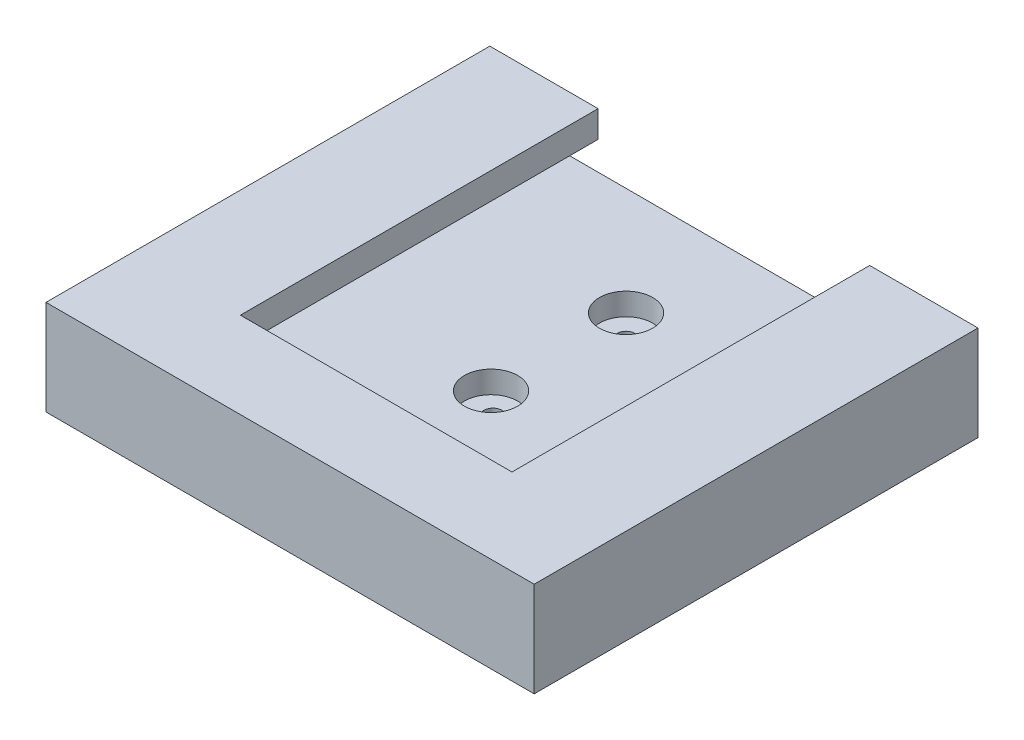
ISO-10303-21;
HEADER;
FILE_DESCRIPTION(('STEP AP214'),'2;1');
FILE_NAME('part.step','',(''),(''),'','','');
FILE_SCHEMA(('AUTOMOTIVE_DESIGN { 1 0 10303 214 1 1 1 1 }'));
ENDSEC;
DATA;
#1=APPLICATION_CONTEXT('core data for automotive mechanical design processes');
#2=APPLICATION_PROTOCOL_DEFINITION('international standard','automotive_design',2000,#1);
#3=PRODUCT_CONTEXT('',#1,'mechanical');
#4=PRODUCT('Part','Part','',(#3));
#5=PRODUCT_RELATED_PRODUCT_CATEGORY('part','',(#4));
#6=PRODUCT_DEFINITION_FORMATION('','',#4);
#7=PRODUCT_DEFINITION_CONTEXT('part definition',#1,'design');
#8=PRODUCT_DEFINITION('design','',#6,#7);
#9=PRODUCT_DEFINITION_SHAPE('','',#8);
#10=(LENGTH_UNIT() NAMED_UNIT(*) SI_UNIT(.MILLI.,.METRE.));
#11=(NAMED_UNIT(*) PLANE_ANGLE_UNIT() SI_UNIT($,.RADIAN.));
#12=(NAMED_UNIT(*) SI_UNIT($,.STERADIAN.) SOLID_ANGLE_UNIT());
#13=UNCERTAINTY_MEASURE_WITH_UNIT(LENGTH_MEASURE(1.E-05),#10,'distance_accuracy_value','');
#14=(GEOMETRIC_REPRESENTATION_CONTEXT(3) GLOBAL_UNCERTAINTY_ASSIGNED_CONTEXT((#13)) GLOBAL_UNIT_ASSIGNED_CONTEXT((#10,
#11,#12)) REPRESENTATION_CONTEXT('',''));
#15=CARTESIAN_POINT('',(0.,0.,0.));
#16=DIRECTION('',(0.,0.,1.));
#17=DIRECTION('',(1.,0.,0.));
#18=AXIS2_PLACEMENT_3D('',#15,#16,#17);
#19=CARTESIAN_POINT('',(27.4999999999998,10.7,-24.9999999999998));
#20=DIRECTION('',(-1.,0.,0.));
#21=DIRECTION('',(0.,0.,1.));
#22=AXIS2_PLACEMENT_3D('',#19,#20,#21);
#23=PLANE('',#22);
#24=DIRECTION('',(0.,0.,-1.));
#25=VECTOR('',#24,1.);
#26=CARTESIAN_POINT('',(27.4999999999998,0.,-24.9999999999998));
#27=LINE('',#26,#25);
#28=CARTESIAN_POINT('',(27.4999999999998,0.,25.0000000000002));
#29=VERTEX_POINT('',#28);
#30=CARTESIAN_POINT('',(27.4999999999998,0.,-24.9999999999998));
#31=VERTEX_POINT('',#30);
#32=EDGE_CURVE('E225',#29,#31,#27,.T.);
#33=ORIENTED_EDGE('',*,*,#32,.T.);
#34=DIRECTION('',(0.,-1.,0.));
#35=VECTOR('',#34,1.);
#36=CARTESIAN_POINT('',(27.4999999999998,10.7,-24.9999999999998));
#37=LINE('',#36,#35);
#38=CARTESIAN_POINT('',(27.4999999999998,10.7,-24.9999999999998));
#39=VERTEX_POINT('',#38);
#40=EDGE_CURVE('E11',#39,#31,#37,.T.);
#41=ORIENTED_EDGE('',*,*,#40,.F.);
#42=DIRECTION('',(0.,0.,-1.));
#43=VECTOR('',#42,1.);
#44=CARTESIAN_POINT('',(27.4999999999998,10.7,-24.9999999999998));
#45=LINE('',#44,#43);
#46=CARTESIAN_POINT('',(27.4999999999998,10.7,25.0000000000002));
#47=VERTEX_POINT('',#46);
#48=EDGE_CURVE('E234',#47,#39,#45,.T.);
#49=ORIENTED_EDGE('',*,*,#48,.F.);
#50=DIRECTION('',(0.,-1.,0.));
#51=VECTOR('',#50,1.);
#52=CARTESIAN_POINT('',(27.4999999999998,10.7,25.0000000000002));
#53=LINE('',#52,#51);
#54=EDGE_CURVE('E245',#47,#29,#53,.T.);
#55=ORIENTED_EDGE('',*,*,#54,.T.);
#56=EDGE_LOOP('',(#33,#41,#49,#55));
#57=FACE_BOUND('',#56,.T.);
#58=ADVANCED_FACE('F45',(#57),#23,.F.);
#59=CARTESIAN_POINT('',(-27.5000000000002,10.7,-24.9999999999998));
#60=DIRECTION('',(0.,0.,1.));
#61=DIRECTION('',(1.,0.,0.));
#62=AXIS2_PLACEMENT_3D('',#59,#60,#61);
#63=PLANE('',#62);
#64=DIRECTION('',(0.,1.,0.));
#65=VECTOR('',#64,1.);
#66=CARTESIAN_POINT('',(20.2999999999998,4.5,-24.9999999999998));
#67=LINE('',#66,#65);
#68=CARTESIAN_POINT('',(20.2999999999998,4.5,-24.9999999999998));
#69=VERTEX_POINT('',#68);
#70=CARTESIAN_POINT('',(20.2999999999998,7.7,-24.9999999999998));
#71=VERTEX_POINT('',#70);
#72=EDGE_CURVE('E200',#69,#71,#67,.T.);
#73=ORIENTED_EDGE('',*,*,#72,.T.);
#74=DIRECTION('',(-1.,0.,0.));
#75=VECTOR('',#74,1.);
#76=CARTESIAN_POINT('',(-20.3000000000002,7.7,-24.9999999999998));
#77=LINE('',#76,#75);
#78=CARTESIAN_POINT('',(15.2999999999998,7.7,-24.9999999999998));
#79=VERTEX_POINT('',#78);
#80=EDGE_CURVE('E173',#71,#79,#77,.T.);
#81=ORIENTED_EDGE('',*,*,#80,.T.);
#82=DIRECTION('',(0.,1.,0.));
#83=VECTOR('',#82,1.);
#84=CARTESIAN_POINT('',(15.2999999999998,7.7,-24.9999999999998));
#85=LINE('',#84,#83);
#86=CARTESIAN_POINT('',(15.2999999999998,10.7,-24.9999999999998));
#87=VERTEX_POINT('',#86);
#88=EDGE_CURVE('E226',#79,#87,#85,.T.);
#89=ORIENTED_EDGE('',*,*,#88,.T.);
#90=DIRECTION('',(-1.,0.,0.));
#91=VECTOR('',#90,1.);
#92=CARTESIAN_POINT('',(-27.5000000000002,10.7,-24.9999999999998));
#93=LINE('',#92,#91);
#94=EDGE_CURVE('E97',#39,#87,#93,.T.);
#95=ORIENTED_EDGE('',*,*,#94,.F.);
#96=ORIENTED_EDGE('',*,*,#40,.T.);
#97=DIRECTION('',(-1.,0.,0.));
#98=VECTOR('',#97,1.);
#99=CARTESIAN_POINT('',(-27.5000000000002,0.,-24.9999999999998));
#100=LINE('',#99,#98);
#101=CARTESIAN_POINT('',(-27.5000000000002,0.,-24.9999999999998));
#102=VERTEX_POINT('',#101);
#103=EDGE_CURVE('E249',#31,#102,#100,.T.);
#104=ORIENTED_EDGE('',*,*,#103,.T.);
#105=DIRECTION('',(0.,-1.,0.));
#106=VECTOR('',#105,1.);
#107=CARTESIAN_POINT('',(-27.5000000000002,10.7,-24.9999999999998));
#108=LINE('',#107,#106);
#109=CARTESIAN_POINT('',(-27.5000000000002,10.7,-24.9999999999998));
#110=VERTEX_POINT('',#109);
#111=EDGE_CURVE('E53',#110,#102,#108,.T.);
#112=ORIENTED_EDGE('',*,*,#111,.F.);
#113=CARTESIAN_POINT('',(-15.3000000000002,10.7,-24.9999999999998));
#114=VERTEX_POINT('',#113);
#115=EDGE_CURVE('E237',#114,#110,#93,.T.);
#116=ORIENTED_EDGE('',*,*,#115,.F.);
#117=DIRECTION('',(0.,1.,0.));
#118=VECTOR('',#117,1.);
#119=CARTESIAN_POINT('',(-15.3000000000002,7.7,-24.9999999999998));
#120=LINE('',#119,#118);
#121=CARTESIAN_POINT('',(-15.3000000000002,7.7,-24.9999999999998));
#122=VERTEX_POINT('',#121);
#123=EDGE_CURVE('E222',#122,#114,#120,.T.);
#124=ORIENTED_EDGE('',*,*,#123,.F.);
#125=CARTESIAN_POINT('',(-20.3000000000002,7.7,-24.9999999999998));
#126=VERTEX_POINT('',#125);
#127=EDGE_CURVE('E177',#122,#126,#77,.T.);
#128=ORIENTED_EDGE('',*,*,#127,.T.);
#129=DIRECTION('',(0.,1.,0.));
#130=VECTOR('',#129,1.);
#131=CARTESIAN_POINT('',(-20.3000000000002,4.5,-24.9999999999998));
#132=LINE('',#131,#130);
#133=CARTESIAN_POINT('',(-20.3000000000002,4.5,-24.9999999999998));
#134=VERTEX_POINT('',#133);
#135=EDGE_CURVE('E197',#134,#126,#132,.T.);
#136=ORIENTED_EDGE('',*,*,#135,.F.);
#137=DIRECTION('',(-1.,0.,0.));
#138=VECTOR('',#137,1.);
#139=CARTESIAN_POINT('',(-20.3000000000002,4.5,-24.9999999999998));
#140=LINE('',#139,#138);
#141=EDGE_CURVE('E156',#69,#134,#140,.T.);
#142=ORIENTED_EDGE('',*,*,#141,.F.);
#143=EDGE_LOOP('',(#73,#81,#89,#95,#96,#104,#112,#116,#124,#128,#136,#142));
#144=FACE_BOUND('',#143,.T.);
#145=ADVANCED_FACE('F285',(#144),#63,.F.);
#146=CARTESIAN_POINT('',(-27.5000000000002,10.7,-24.9999999999998));
#147=DIRECTION('',(1.,0.,0.));
#148=DIRECTION('',(0.,0.,-1.));
#149=AXIS2_PLACEMENT_3D('',#146,#147,#148);
#150=PLANE('',#149);
#151=DIRECTION('',(0.,0.,1.));
#152=VECTOR('',#151,1.);
#153=CARTESIAN_POINT('',(-27.5000000000002,0.,-24.9999999999998));
#154=LINE('',#153,#152);
#155=CARTESIAN_POINT('',(-27.5000000000002,0.,25.0000000000002));
#156=VERTEX_POINT('',#155);
#157=EDGE_CURVE('E252',#102,#156,#154,.T.);
#158=ORIENTED_EDGE('',*,*,#157,.T.);
#159=DIRECTION('',(0.,-1.,0.));
#160=VECTOR('',#159,1.);
#161=CARTESIAN_POINT('',(-27.5000000000002,10.7,25.0000000000002));
#162=LINE('',#161,#160);
#163=CARTESIAN_POINT('',(-27.5000000000002,10.7,25.0000000000002));
#164=VERTEX_POINT('',#163);
#165=EDGE_CURVE('E259',#164,#156,#162,.T.);
#166=ORIENTED_EDGE('',*,*,#165,.F.);
#167=DIRECTION('',(0.,0.,1.));
#168=VECTOR('',#167,1.);
#169=CARTESIAN_POINT('',(-27.5000000000002,10.7,-24.9999999999998));
#170=LINE('',#169,#168);
#171=EDGE_CURVE('E240',#110,#164,#170,.T.);
#172=ORIENTED_EDGE('',*,*,#171,.F.);
#173=ORIENTED_EDGE('',*,*,#111,.T.);
#174=EDGE_LOOP('',(#158,#166,#172,#173));
#175=FACE_BOUND('',#174,.T.);
#176=ADVANCED_FACE('F267',(#175),#150,.F.);
#177=CARTESIAN_POINT('',(-27.5000000000002,10.7,25.0000000000002));
#178=DIRECTION('',(0.,0.,-1.));
#179=DIRECTION('',(-1.,0.,0.));
#180=AXIS2_PLACEMENT_3D('',#177,#178,#179);
#181=PLANE('',#180);
#182=DIRECTION('',(1.,0.,0.));
#183=VECTOR('',#182,1.);
#184=CARTESIAN_POINT('',(-27.5000000000002,0.,25.0000000000002));
#185=LINE('',#184,#183);
#186=EDGE_CURVE('E90',#156,#29,#185,.T.);
#187=ORIENTED_EDGE('',*,*,#186,.T.);
#188=ORIENTED_EDGE('',*,*,#54,.F.);
#189=DIRECTION('',(1.,0.,0.));
#190=VECTOR('',#189,1.);
#191=CARTESIAN_POINT('',(-27.5000000000002,10.7,25.0000000000002));
#192=LINE('',#191,#190);
#193=EDGE_CURVE('E69',#164,#47,#192,.T.);
#194=ORIENTED_EDGE('',*,*,#193,.F.);
#195=ORIENTED_EDGE('',*,*,#165,.T.);
#196=EDGE_LOOP('',(#187,#188,#194,#195));
#197=FACE_BOUND('',#196,.T.);
#198=ADVANCED_FACE('F276',(#197),#181,.F.);
#199=CARTESIAN_POINT('',(0.,10.7,0.));
#200=DIRECTION('',(0.,1.,0.));
#201=DIRECTION('',(0.,0.,1.));
#202=AXIS2_PLACEMENT_3D('',#199,#200,#201);
#203=PLANE('',#202);
#204=DIRECTION('',(0.,0.,1.));
#205=VECTOR('',#204,1.);
#206=CARTESIAN_POINT('',(-15.3000000000002,10.7,-24.9999999999998));
#207=LINE('',#206,#205);
#208=CARTESIAN_POINT('',(-15.3000000000002,10.7,15.3000000000002));
#209=VERTEX_POINT('',#208);
#210=EDGE_CURVE('E60',#114,#209,#207,.T.);
#211=ORIENTED_EDGE('',*,*,#210,.F.);
#212=ORIENTED_EDGE('',*,*,#115,.T.);
#213=ORIENTED_EDGE('',*,*,#171,.T.);
#214=ORIENTED_EDGE('',*,*,#193,.T.);
#215=ORIENTED_EDGE('',*,*,#48,.T.);
#216=ORIENTED_EDGE('',*,*,#94,.T.);
#217=DIRECTION('',(0.,0.,-1.));
#218=VECTOR('',#217,1.);
#219=CARTESIAN_POINT('',(15.2999999999998,10.7,-24.9999999999998));
#220=LINE('',#219,#218);
#221=CARTESIAN_POINT('',(15.2999999999998,10.7,15.3000000000002));
#222=VERTEX_POINT('',#221);
#223=EDGE_CURVE('E211',#222,#87,#220,.T.);
#224=ORIENTED_EDGE('',*,*,#223,.F.);
#225=DIRECTION('',(1.,0.,0.));
#226=VECTOR('',#225,1.);
#227=CARTESIAN_POINT('',(-15.3000000000002,10.7,15.3000000000002));
#228=LINE('',#227,#226);
#229=EDGE_CURVE('E217',#209,#222,#228,.T.);
#230=ORIENTED_EDGE('',*,*,#229,.F.);
#231=EDGE_LOOP('',(#211,#212,#213,#214,#215,#216,#224,#230));
#232=FACE_BOUND('',#231,.T.);
#233=ADVANCED_FACE('F278',(#232),#203,.T.);
#234=CARTESIAN_POINT('',(0.,0.,0.));
#235=DIRECTION('',(0.,1.,0.));
#236=DIRECTION('',(0.,0.,1.));
#237=AXIS2_PLACEMENT_3D('',#234,#235,#236);
#238=PLANE('',#237);
#239=CARTESIAN_POINT('',(0.,0.,-12.8503180046306));
#240=DIRECTION('',(0.,1.,0.));
#241=DIRECTION('',(0.,0.,1.));
#242=AXIS2_PLACEMENT_3D('',#239,#240,#241);
#243=CIRCLE('',#242,1.);
#244=CARTESIAN_POINT('',(0.,0.,-11.8503180046306));
#245=VERTEX_POINT('',#244);
#246=EDGE_CURVE('E329',#245,#245,#243,.F.);
#247=ORIENTED_EDGE('',*,*,#246,.F.);
#248=EDGE_LOOP('',(#247));
#249=FACE_BOUND('',#248,.T.);
#250=CARTESIAN_POINT('',(0.,0.,2.14968199536938));
#251=DIRECTION('',(0.,1.,0.));
#252=DIRECTION('',(0.,0.,1.));
#253=AXIS2_PLACEMENT_3D('',#250,#251,#252);
#254=CIRCLE('',#253,1.);
#255=CARTESIAN_POINT('',(0.,0.,3.14968199536938));
#256=VERTEX_POINT('',#255);
#257=EDGE_CURVE('E340',#256,#256,#254,.F.);
#258=ORIENTED_EDGE('',*,*,#257,.F.);
#259=EDGE_LOOP('',(#258));
#260=FACE_BOUND('',#259,.T.);
#261=ORIENTED_EDGE('',*,*,#32,.F.);
#262=ORIENTED_EDGE('',*,*,#186,.F.);
#263=ORIENTED_EDGE('',*,*,#157,.F.);
#264=ORIENTED_EDGE('',*,*,#103,.F.);
#265=EDGE_LOOP('',(#261,#262,#263,#264));
#266=FACE_BOUND('',#265,.T.);
#267=ADVANCED_FACE('F272',(#249,#260,#266),#238,.F.);
#268=CARTESIAN_POINT('',(-15.3000000000002,7.7,-24.9999999999998));
#269=DIRECTION('',(-1.,0.,0.));
#270=DIRECTION('',(0.,0.,1.));
#271=AXIS2_PLACEMENT_3D('',#268,#269,#270);
#272=PLANE('',#271);
#273=ORIENTED_EDGE('',*,*,#210,.T.);
#274=DIRECTION('',(0.,1.,0.));
#275=VECTOR('',#274,1.);
#276=CARTESIAN_POINT('',(-15.3000000000002,7.7,15.3000000000002));
#277=LINE('',#276,#275);
#278=CARTESIAN_POINT('',(-15.3000000000002,7.7,15.3000000000002));
#279=VERTEX_POINT('',#278);
#280=EDGE_CURVE('E214',#279,#209,#277,.T.);
#281=ORIENTED_EDGE('',*,*,#280,.F.);
#282=DIRECTION('',(0.,0.,1.));
#283=VECTOR('',#282,1.);
#284=CARTESIAN_POINT('',(-15.3000000000002,7.7,-24.9999999999998));
#285=LINE('',#284,#283);
#286=EDGE_CURVE('E206',#122,#279,#285,.T.);
#287=ORIENTED_EDGE('',*,*,#286,.F.);
#288=ORIENTED_EDGE('',*,*,#123,.T.);
#289=EDGE_LOOP('',(#273,#281,#287,#288));
#290=FACE_BOUND('',#289,.T.);
#291=ADVANCED_FACE('F309',(#290),#272,.F.);
#292=CARTESIAN_POINT('',(15.2999999999998,7.7,-24.9999999999998));
#293=DIRECTION('',(1.,0.,0.));
#294=DIRECTION('',(0.,0.,-1.));
#295=AXIS2_PLACEMENT_3D('',#292,#293,#294);
#296=PLANE('',#295);
#297=ORIENTED_EDGE('',*,*,#223,.T.);
#298=ORIENTED_EDGE('',*,*,#88,.F.);
#299=DIRECTION('',(0.,0.,-1.));
#300=VECTOR('',#299,1.);
#301=CARTESIAN_POINT('',(15.2999999999998,7.7,-24.9999999999998));
#302=LINE('',#301,#300);
#303=CARTESIAN_POINT('',(15.2999999999998,7.7,15.3000000000002));
#304=VERTEX_POINT('',#303);
#305=EDGE_CURVE('E210',#304,#79,#302,.T.);
#306=ORIENTED_EDGE('',*,*,#305,.F.);
#307=DIRECTION('',(0.,1.,0.));
#308=VECTOR('',#307,1.);
#309=CARTESIAN_POINT('',(15.2999999999998,7.7,15.3000000000002));
#310=LINE('',#309,#308);
#311=EDGE_CURVE('E229',#304,#222,#310,.T.);
#312=ORIENTED_EDGE('',*,*,#311,.T.);
#313=EDGE_LOOP('',(#297,#298,#306,#312));
#314=FACE_BOUND('',#313,.T.);
#315=ADVANCED_FACE('F305',(#314),#296,.F.);
#316=CARTESIAN_POINT('',(-15.3000000000002,7.7,15.3000000000002));
#317=DIRECTION('',(0.,0.,1.));
#318=DIRECTION('',(1.,0.,0.));
#319=AXIS2_PLACEMENT_3D('',#316,#317,#318);
#320=PLANE('',#319);
#321=ORIENTED_EDGE('',*,*,#229,.T.);
#322=ORIENTED_EDGE('',*,*,#311,.F.);
#323=DIRECTION('',(1.,0.,0.));
#324=VECTOR('',#323,1.);
#325=CARTESIAN_POINT('',(-20.3000000000002,7.7,15.3000000000002));
#326=LINE('',#325,#324);
#327=CARTESIAN_POINT('',(20.2999999999998,7.7,15.3000000000002));
#328=VERTEX_POINT('',#327);
#329=EDGE_CURVE('E189',#304,#328,#326,.T.);
#330=ORIENTED_EDGE('',*,*,#329,.T.);
#331=DIRECTION('',(0.,1.,0.));
#332=VECTOR('',#331,1.);
#333=CARTESIAN_POINT('',(20.2999999999998,4.5,15.3000000000002));
#334=LINE('',#333,#332);
#335=CARTESIAN_POINT('',(20.2999999999998,4.5,15.3000000000002));
#336=VERTEX_POINT('',#335);
#337=EDGE_CURVE('E155',#336,#328,#334,.T.);
#338=ORIENTED_EDGE('',*,*,#337,.F.);
#339=DIRECTION('',(1.,0.,0.));
#340=VECTOR('',#339,1.);
#341=CARTESIAN_POINT('',(-20.3000000000002,4.5,15.3000000000002));
#342=LINE('',#341,#340);
#343=CARTESIAN_POINT('',(-20.3000000000002,4.5,15.3000000000002));
#344=VERTEX_POINT('',#343);
#345=EDGE_CURVE('E159',#344,#336,#342,.T.);
#346=ORIENTED_EDGE('',*,*,#345,.F.);
#347=DIRECTION('',(0.,1.,0.));
#348=VECTOR('',#347,1.);
#349=CARTESIAN_POINT('',(-20.3000000000002,4.5,15.3000000000002));
#350=LINE('',#349,#348);
#351=CARTESIAN_POINT('',(-20.3000000000002,7.7,15.3000000000002));
#352=VERTEX_POINT('',#351);
#353=EDGE_CURVE('E144',#344,#352,#350,.T.);
#354=ORIENTED_EDGE('',*,*,#353,.T.);
#355=EDGE_CURVE('E191',#352,#279,#326,.T.);
#356=ORIENTED_EDGE('',*,*,#355,.T.);
#357=ORIENTED_EDGE('',*,*,#280,.T.);
#358=EDGE_LOOP('',(#321,#322,#330,#338,#346,#354,#356,#357));
#359=FACE_BOUND('',#358,.T.);
#360=ADVANCED_FACE('F161',(#359),#320,.F.);
#361=CARTESIAN_POINT('',(0.,7.7,0.));
#362=DIRECTION('',(0.,1.,0.));
#363=DIRECTION('',(0.,0.,1.));
#364=AXIS2_PLACEMENT_3D('',#361,#362,#363);
#365=PLANE('',#364);
#366=ORIENTED_EDGE('',*,*,#355,.F.);
#367=DIRECTION('',(0.,0.,1.));
#368=VECTOR('',#367,1.);
#369=CARTESIAN_POINT('',(-20.3000000000002,7.7,-24.9999999999998));
#370=LINE('',#369,#368);
#371=EDGE_CURVE('E151',#126,#352,#370,.T.);
#372=ORIENTED_EDGE('',*,*,#371,.F.);
#373=ORIENTED_EDGE('',*,*,#127,.F.);
#374=ORIENTED_EDGE('',*,*,#286,.T.);
#375=EDGE_LOOP('',(#366,#372,#373,#374));
#376=FACE_BOUND('',#375,.T.);
#377=ADVANCED_FACE('F360',(#376),#365,.F.);
#378=ORIENTED_EDGE('',*,*,#80,.F.);
#379=DIRECTION('',(0.,0.,-1.));
#380=VECTOR('',#379,1.);
#381=CARTESIAN_POINT('',(20.2999999999998,7.7,-24.9999999999998));
#382=LINE('',#381,#380);
#383=EDGE_CURVE('E194',#328,#71,#382,.T.);
#384=ORIENTED_EDGE('',*,*,#383,.F.);
#385=ORIENTED_EDGE('',*,*,#329,.F.);
#386=ORIENTED_EDGE('',*,*,#305,.T.);
#387=EDGE_LOOP('',(#378,#384,#385,#386));
#388=FACE_BOUND('',#387,.T.);
#389=ADVANCED_FACE('F301',(#388),#365,.F.);
#390=CARTESIAN_POINT('',(-20.3000000000002,4.5,-24.9999999999998));
#391=DIRECTION('',(-1.,0.,0.));
#392=DIRECTION('',(0.,0.,1.));
#393=AXIS2_PLACEMENT_3D('',#390,#391,#392);
#394=PLANE('',#393);
#395=ORIENTED_EDGE('',*,*,#371,.T.);
#396=ORIENTED_EDGE('',*,*,#353,.F.);
#397=DIRECTION('',(0.,0.,1.));
#398=VECTOR('',#397,1.);
#399=CARTESIAN_POINT('',(-20.3000000000002,4.5,-24.9999999999998));
#400=LINE('',#399,#398);
#401=EDGE_CURVE('E148',#134,#344,#400,.T.);
#402=ORIENTED_EDGE('',*,*,#401,.F.);
#403=ORIENTED_EDGE('',*,*,#135,.T.);
#404=EDGE_LOOP('',(#395,#396,#402,#403));
#405=FACE_BOUND('',#404,.T.);
#406=ADVANCED_FACE('F146',(#405),#394,.F.);
#407=CARTESIAN_POINT('',(20.2999999999998,4.5,-24.9999999999998));
#408=DIRECTION('',(1.,0.,0.));
#409=DIRECTION('',(0.,0.,-1.));
#410=AXIS2_PLACEMENT_3D('',#407,#408,#409);
#411=PLANE('',#410);
#412=ORIENTED_EDGE('',*,*,#383,.T.);
#413=ORIENTED_EDGE('',*,*,#72,.F.);
#414=DIRECTION('',(0.,0.,-1.));
#415=VECTOR('',#414,1.);
#416=CARTESIAN_POINT('',(20.2999999999998,4.5,-24.9999999999998));
#417=LINE('',#416,#415);
#418=EDGE_CURVE('E167',#336,#69,#417,.T.);
#419=ORIENTED_EDGE('',*,*,#418,.F.);
#420=ORIENTED_EDGE('',*,*,#337,.T.);
#421=EDGE_LOOP('',(#412,#413,#419,#420));
#422=FACE_BOUND('',#421,.T.);
#423=ADVANCED_FACE('F298',(#422),#411,.F.);
#424=CARTESIAN_POINT('',(0.,4.5,0.));
#425=DIRECTION('',(0.,1.,0.));
#426=DIRECTION('',(0.,0.,1.));
#427=AXIS2_PLACEMENT_3D('',#424,#425,#426);
#428=PLANE('',#427);
#429=CARTESIAN_POINT('',(0.,4.5,-12.8503180046306));
#430=DIRECTION('',(0.,1.,0.));
#431=DIRECTION('',(0.,0.,1.));
#432=AXIS2_PLACEMENT_3D('',#429,#430,#431);
#433=CIRCLE('',#432,3.);
#434=CARTESIAN_POINT('',(0.,4.5,-9.85031800463062));
#435=VERTEX_POINT('',#434);
#436=EDGE_CURVE('E319',#435,#435,#433,.T.);
#437=ORIENTED_EDGE('',*,*,#436,.F.);
#438=EDGE_LOOP('',(#437));
#439=FACE_BOUND('',#438,.T.);
#440=CARTESIAN_POINT('',(0.,4.5,2.35993721137717));
#441=DIRECTION('',(0.,1.,0.));
#442=DIRECTION('',(0.,0.,1.));
#443=AXIS2_PLACEMENT_3D('',#440,#441,#442);
#444=CIRCLE('',#443,3.);
#445=CARTESIAN_POINT('',(0.,4.5,5.35993721137717));
#446=VERTEX_POINT('',#445);
#447=EDGE_CURVE('E323',#446,#446,#444,.T.);
#448=ORIENTED_EDGE('',*,*,#447,.F.);
#449=EDGE_LOOP('',(#448));
#450=FACE_BOUND('',#449,.T.);
#451=ORIENTED_EDGE('',*,*,#401,.T.);
#452=ORIENTED_EDGE('',*,*,#345,.T.);
#453=ORIENTED_EDGE('',*,*,#418,.T.);
#454=ORIENTED_EDGE('',*,*,#141,.T.);
#455=EDGE_LOOP('',(#451,#452,#453,#454));
#456=FACE_BOUND('',#455,.T.);
#457=ADVANCED_FACE('F169',(#439,#450,#456),#428,.T.);
#458=CARTESIAN_POINT('',(0.,2.,2.35993721137717));
#459=DIRECTION('',(0.,1.,0.));
#460=DIRECTION('',(0.,0.,1.));
#461=AXIS2_PLACEMENT_3D('',#458,#459,#460);
#462=CYLINDRICAL_SURFACE('',#461,3.);
#463=CARTESIAN_POINT('',(0.,2.,2.35993721137717));
#464=DIRECTION('',(0.,1.,0.));
#465=DIRECTION('',(0.,0.,1.));
#466=AXIS2_PLACEMENT_3D('',#463,#464,#465);
#467=CIRCLE('',#466,3.);
#468=CARTESIAN_POINT('',(0.,2.,5.35993721137717));
#469=VERTEX_POINT('',#468);
#470=EDGE_CURVE('E180',#469,#469,#467,.T.);
#471=ORIENTED_EDGE('',*,*,#470,.F.);
#472=EDGE_LOOP('',(#471));
#473=FACE_BOUND('',#472,.T.);
#474=ORIENTED_EDGE('',*,*,#447,.T.);
#475=EDGE_LOOP('',(#474));
#476=FACE_BOUND('',#475,.T.);
#477=ADVANCED_FACE('F371',(#473,#476),#462,.F.);
#478=CARTESIAN_POINT('',(0.,2.,2.35993721137717));
#479=DIRECTION('',(0.,1.,0.));
#480=DIRECTION('',(0.,0.,1.));
#481=AXIS2_PLACEMENT_3D('',#478,#479,#480);
#482=PLANE('',#481);
#483=CARTESIAN_POINT('',(0.,2.,2.14968199536938));
#484=DIRECTION('',(0.,1.,0.));
#485=DIRECTION('',(0.,0.,1.));
#486=AXIS2_PLACEMENT_3D('',#483,#484,#485);
#487=CIRCLE('',#486,1.);
#488=CARTESIAN_POINT('',(0.,2.,3.14968199536938));
#489=VERTEX_POINT('',#488);
#490=EDGE_CURVE('E336',#489,#489,#487,.T.);
#491=ORIENTED_EDGE('',*,*,#490,.F.);
#492=EDGE_LOOP('',(#491));
#493=FACE_BOUND('',#492,.T.);
#494=ORIENTED_EDGE('',*,*,#470,.T.);
#495=EDGE_LOOP('',(#494));
#496=FACE_BOUND('',#495,.T.);
#497=ADVANCED_FACE('F373',(#493,#496),#482,.T.);
#498=CARTESIAN_POINT('',(0.,2.,-12.8503180046306));
#499=DIRECTION('',(0.,1.,0.));
#500=DIRECTION('',(0.,0.,1.));
#501=AXIS2_PLACEMENT_3D('',#498,#499,#500);
#502=CYLINDRICAL_SURFACE('',#501,3.);
#503=CARTESIAN_POINT('',(0.,2.,-12.8503180046306));
#504=DIRECTION('',(0.,1.,0.));
#505=DIRECTION('',(0.,0.,1.));
#506=AXIS2_PLACEMENT_3D('',#503,#504,#505);
#507=CIRCLE('',#506,3.);
#508=CARTESIAN_POINT('',(0.,2.,-9.85031800463062));
#509=VERTEX_POINT('',#508);
#510=EDGE_CURVE('E190',#509,#509,#507,.T.);
#511=ORIENTED_EDGE('',*,*,#510,.F.);
#512=EDGE_LOOP('',(#511));
#513=FACE_BOUND('',#512,.T.);
#514=ORIENTED_EDGE('',*,*,#436,.T.);
#515=EDGE_LOOP('',(#514));
#516=FACE_BOUND('',#515,.T.);
#517=ADVANCED_FACE('F375',(#513,#516),#502,.F.);
#518=CARTESIAN_POINT('',(0.,2.,-12.8503180046306));
#519=DIRECTION('',(0.,1.,0.));
#520=DIRECTION('',(0.,0.,1.));
#521=AXIS2_PLACEMENT_3D('',#518,#519,#520);
#522=PLANE('',#521);
#523=CARTESIAN_POINT('',(0.,2.,-12.8503180046306));
#524=DIRECTION('',(0.,1.,0.));
#525=DIRECTION('',(0.,0.,1.));
#526=AXIS2_PLACEMENT_3D('',#523,#524,#525);
#527=CIRCLE('',#526,1.);
#528=CARTESIAN_POINT('',(0.,2.,-11.8503180046306));
#529=VERTEX_POINT('',#528);
#530=EDGE_CURVE('E332',#529,#529,#527,.T.);
#531=ORIENTED_EDGE('',*,*,#530,.F.);
#532=EDGE_LOOP('',(#531));
#533=FACE_BOUND('',#532,.T.);
#534=ORIENTED_EDGE('',*,*,#510,.T.);
#535=EDGE_LOOP('',(#534));
#536=FACE_BOUND('',#535,.T.);
#537=ADVANCED_FACE('F381',(#533,#536),#522,.T.);
#538=CARTESIAN_POINT('',(0.,-2.82842712474619,2.14968199536938));
#539=DIRECTION('',(0.,1.,0.));
#540=DIRECTION('',(0.,0.,1.));
#541=AXIS2_PLACEMENT_3D('',#538,#539,#540);
#542=CYLINDRICAL_SURFACE('',#541,1.);
#543=ORIENTED_EDGE('',*,*,#257,.T.);
#544=EDGE_LOOP('',(#543));
#545=FACE_BOUND('',#544,.T.);
#546=ORIENTED_EDGE('',*,*,#490,.T.);
#547=EDGE_LOOP('',(#546));
#548=FACE_BOUND('',#547,.T.);
#549=ADVANCED_FACE('F346',(#545,#548),#542,.F.);
#550=CARTESIAN_POINT('',(0.,-2.82842712474619,-12.8503180046306));
#551=DIRECTION('',(0.,1.,0.));
#552=DIRECTION('',(0.,0.,1.));
#553=AXIS2_PLACEMENT_3D('',#550,#551,#552);
#554=CYLINDRICAL_SURFACE('',#553,1.);
#555=ORIENTED_EDGE('',*,*,#246,.T.);
#556=EDGE_LOOP('',(#555));
#557=FACE_BOUND('',#556,.T.);
#558=ORIENTED_EDGE('',*,*,#530,.T.);
#559=EDGE_LOOP('',(#558));
#560=FACE_BOUND('',#559,.T.);
#561=ADVANCED_FACE('F388',(#557,#560),#554,.F.);
#562=CLOSED_SHELL('',(#58,#145,#176,#198,#233,#267,#291,#315,#360,#377,#389,#406,#423,#457,#477,
#497,#517,#537,#549,#561));
#563=MANIFOLD_SOLID_BREP('B2',#562);
#564=ADVANCED_BREP_SHAPE_REPRESENTATION('',(#18,#563),#14);
#565=SHAPE_DEFINITION_REPRESENTATION(#9,#564);
ENDSEC;
END-ISO-10303-21;
